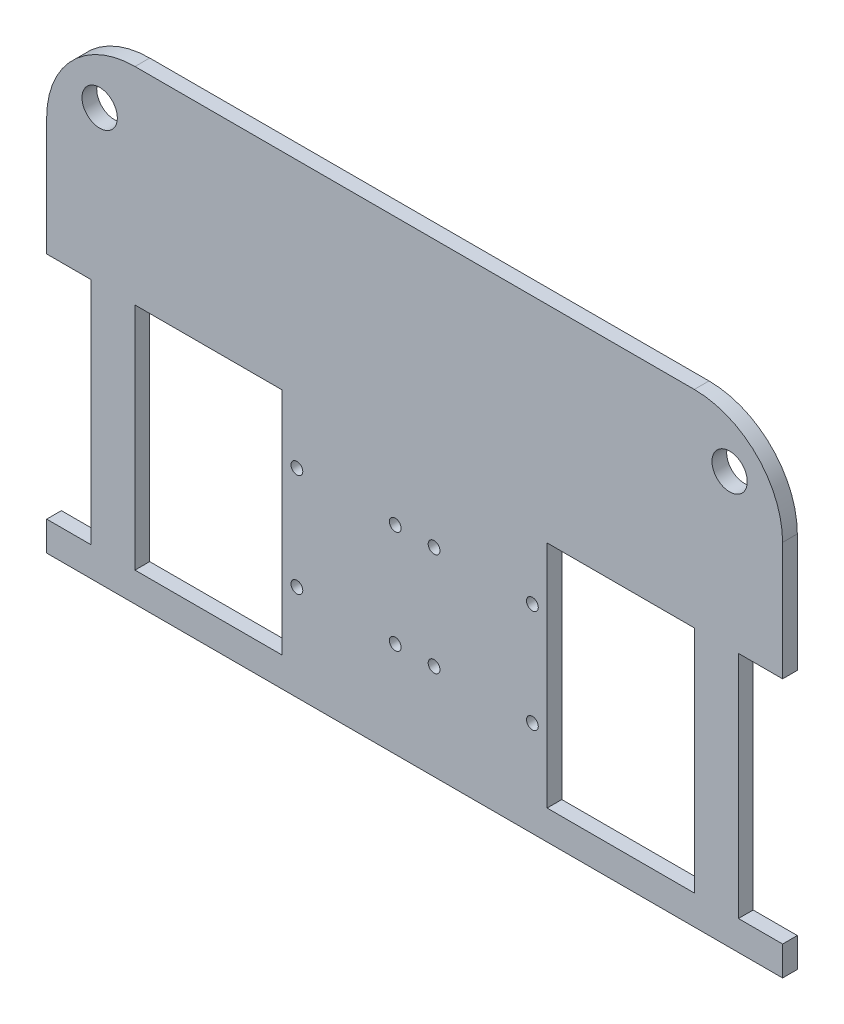
ISO-10303-21;
HEADER;
FILE_DESCRIPTION(('STEP AP214'),'2;1');
FILE_NAME('part.step','',(''),(''),'','','');
FILE_SCHEMA(('AUTOMOTIVE_DESIGN { 1 0 10303 214 1 1 1 1 }'));
ENDSEC;
DATA;
#1=APPLICATION_CONTEXT('core data for automotive mechanical design processes');
#2=APPLICATION_PROTOCOL_DEFINITION('international standard','automotive_design',2000,#1);
#3=PRODUCT_CONTEXT('',#1,'mechanical');
#4=PRODUCT('Part','Part','',(#3));
#5=PRODUCT_RELATED_PRODUCT_CATEGORY('part','',(#4));
#6=PRODUCT_DEFINITION_FORMATION('','',#4);
#7=PRODUCT_DEFINITION_CONTEXT('part definition',#1,'design');
#8=PRODUCT_DEFINITION('design','',#6,#7);
#9=PRODUCT_DEFINITION_SHAPE('','',#8);
#10=(LENGTH_UNIT() NAMED_UNIT(*) SI_UNIT(.MILLI.,.METRE.));
#11=(NAMED_UNIT(*) PLANE_ANGLE_UNIT() SI_UNIT($,.RADIAN.));
#12=(NAMED_UNIT(*) SI_UNIT($,.STERADIAN.) SOLID_ANGLE_UNIT());
#13=UNCERTAINTY_MEASURE_WITH_UNIT(LENGTH_MEASURE(1.E-05),#10,'distance_accuracy_value','');
#14=(GEOMETRIC_REPRESENTATION_CONTEXT(3) GLOBAL_UNCERTAINTY_ASSIGNED_CONTEXT((#13)) GLOBAL_UNIT_ASSIGNED_CONTEXT((#10,
#11,#12)) REPRESENTATION_CONTEXT('',''));
#15=CARTESIAN_POINT('',(0.,0.,0.));
#16=DIRECTION('',(0.,0.,1.));
#17=DIRECTION('',(1.,0.,0.));
#18=AXIS2_PLACEMENT_3D('',#15,#16,#17);
#19=CARTESIAN_POINT('',(0.,-74.4141853683438,-5.));
#20=DIRECTION('',(0.,-1.,0.));
#21=DIRECTION('',(0.,0.,-1.));
#22=AXIS2_PLACEMENT_3D('',#19,#20,#21);
#23=PLANE('',#22);
#24=DIRECTION('',(-1.,0.,0.));
#25=VECTOR('',#24,1.);
#26=CARTESIAN_POINT('',(114.232692949857,-74.4141853683438,0.));
#27=LINE('',#26,#25);
#28=CARTESIAN_POINT('',(-25.7673070501428,-74.4141853683438,0.));
#29=VERTEX_POINT('',#28);
#30=CARTESIAN_POINT('',(-75.7673070501427,-74.4141853683438,0.));
#31=VERTEX_POINT('',#30);
#32=EDGE_CURVE('E11',#29,#31,#27,.T.);
#33=ORIENTED_EDGE('',*,*,#32,.T.);
#34=DIRECTION('',(0.,0.,-1.));
#35=VECTOR('',#34,1.);
#36=CARTESIAN_POINT('',(-75.7673070501427,-74.4141853683437,5.));
#37=LINE('',#36,#35);
#38=CARTESIAN_POINT('',(-75.7673070501427,-74.4141853683438,5.));
#39=VERTEX_POINT('',#38);
#40=EDGE_CURVE('E49',#39,#31,#37,.T.);
#41=ORIENTED_EDGE('',*,*,#40,.F.);
#42=DIRECTION('',(1.,0.,0.));
#43=VECTOR('',#42,1.);
#44=CARTESIAN_POINT('',(0.,-74.4141853683438,5.));
#45=LINE('',#44,#43);
#46=CARTESIAN_POINT('',(-25.7673070501428,-74.4141853683438,5.));
#47=VERTEX_POINT('',#46);
#48=EDGE_CURVE('E252',#39,#47,#45,.T.);
#49=ORIENTED_EDGE('',*,*,#48,.T.);
#50=DIRECTION('',(0.,0.,1.));
#51=VECTOR('',#50,1.);
#52=CARTESIAN_POINT('',(-25.7673070501428,-74.4141853683438,-5.));
#53=LINE('',#52,#51);
#54=EDGE_CURVE('E258',#29,#47,#53,.T.);
#55=ORIENTED_EDGE('',*,*,#54,.F.);
#56=EDGE_LOOP('',(#33,#41,#49,#55));
#57=FACE_BOUND('',#56,.T.);
#58=ADVANCED_FACE('F35',(#57),#23,.F.);
#59=CARTESIAN_POINT('',(0.,3.58581463165624,-5.));
#60=DIRECTION('',(0.,1.,0.));
#61=DIRECTION('',(-1.,0.,0.));
#62=AXIS2_PLACEMENT_3D('',#59,#60,#61);
#63=PLANE('',#62);
#64=DIRECTION('',(-1.,0.,0.));
#65=VECTOR('',#64,1.);
#66=CARTESIAN_POINT('',(0.,3.58581463165624,5.));
#67=LINE('',#66,#65);
#68=CARTESIAN_POINT('',(-25.7673070501428,3.58581463165623,5.));
#69=VERTEX_POINT('',#68);
#70=CARTESIAN_POINT('',(-75.7673070501427,3.58581463165623,5.));
#71=VERTEX_POINT('',#70);
#72=EDGE_CURVE('E256',#69,#71,#67,.T.);
#73=ORIENTED_EDGE('',*,*,#72,.T.);
#74=DIRECTION('',(0.,0.,-1.));
#75=VECTOR('',#74,1.);
#76=CARTESIAN_POINT('',(-75.7673070501427,3.58581463165627,5.));
#77=LINE('',#76,#75);
#78=CARTESIAN_POINT('',(-75.7673070501427,3.58581463165627,0.));
#79=VERTEX_POINT('',#78);
#80=EDGE_CURVE('E212',#71,#79,#77,.T.);
#81=ORIENTED_EDGE('',*,*,#80,.T.);
#82=DIRECTION('',(1.,0.,0.));
#83=VECTOR('',#82,1.);
#84=CARTESIAN_POINT('',(114.232692949857,3.58581463165624,0.));
#85=LINE('',#84,#83);
#86=CARTESIAN_POINT('',(-25.7673070501428,3.58581463165623,0.));
#87=VERTEX_POINT('',#86);
#88=EDGE_CURVE('E400',#79,#87,#85,.T.);
#89=ORIENTED_EDGE('',*,*,#88,.T.);
#90=DIRECTION('',(0.,0.,1.));
#91=VECTOR('',#90,1.);
#92=CARTESIAN_POINT('',(-25.7673070501428,3.58581463165623,-5.));
#93=LINE('',#92,#91);
#94=EDGE_CURVE('E265',#87,#69,#93,.T.);
#95=ORIENTED_EDGE('',*,*,#94,.T.);
#96=EDGE_LOOP('',(#73,#81,#89,#95));
#97=FACE_BOUND('',#96,.T.);
#98=ADVANCED_FACE('F404',(#97),#63,.F.);
#99=CARTESIAN_POINT('',(0.,-74.4141853683438,-5.));
#100=DIRECTION('',(0.,1.,0.));
#101=DIRECTION('',(-1.,0.,0.));
#102=AXIS2_PLACEMENT_3D('',#99,#100,#101);
#103=PLANE('',#102);
#104=DIRECTION('',(0.,0.,-1.));
#105=VECTOR('',#104,1.);
#106=CARTESIAN_POINT('',(114.232692949857,-74.4141853683438,5.));
#107=LINE('',#106,#105);
#108=CARTESIAN_POINT('',(114.232692949857,-74.4141853683438,5.));
#109=VERTEX_POINT('',#108);
#110=CARTESIAN_POINT('',(114.232692949857,-74.4141853683438,0.));
#111=VERTEX_POINT('',#110);
#112=EDGE_CURVE('E230',#109,#111,#107,.T.);
#113=ORIENTED_EDGE('',*,*,#112,.T.);
#114=DIRECTION('',(1.,0.,0.));
#115=VECTOR('',#114,1.);
#116=CARTESIAN_POINT('',(114.232692949857,-74.4141853683438,0.));
#117=LINE('',#116,#115);
#118=CARTESIAN_POINT('',(64.2326929498572,-74.4141853683438,0.));
#119=VERTEX_POINT('',#118);
#120=EDGE_CURVE('E386',#119,#111,#117,.T.);
#121=ORIENTED_EDGE('',*,*,#120,.F.);
#122=DIRECTION('',(0.,0.,1.));
#123=VECTOR('',#122,1.);
#124=CARTESIAN_POINT('',(64.2326929498572,-74.4141853683438,-5.));
#125=LINE('',#124,#123);
#126=CARTESIAN_POINT('',(64.2326929498572,-74.4141853683438,5.));
#127=VERTEX_POINT('',#126);
#128=EDGE_CURVE('E275',#119,#127,#125,.T.);
#129=ORIENTED_EDGE('',*,*,#128,.T.);
#130=DIRECTION('',(-1.,0.,0.));
#131=VECTOR('',#130,1.);
#132=CARTESIAN_POINT('',(0.,-74.4141853683438,5.));
#133=LINE('',#132,#131);
#134=EDGE_CURVE('E311',#109,#127,#133,.T.);
#135=ORIENTED_EDGE('',*,*,#134,.F.);
#136=EDGE_LOOP('',(#113,#121,#129,#135));
#137=FACE_BOUND('',#136,.T.);
#138=ADVANCED_FACE('F440',(#137),#103,.T.);
#139=CARTESIAN_POINT('',(0.,3.58581463165623,-5.));
#140=DIRECTION('',(0.,-1.,0.));
#141=DIRECTION('',(1.,0.,0.));
#142=AXIS2_PLACEMENT_3D('',#139,#140,#141);
#143=PLANE('',#142);
#144=DIRECTION('',(0.,0.,-1.));
#145=VECTOR('',#144,1.);
#146=CARTESIAN_POINT('',(114.232692949857,3.58581463165625,5.));
#147=LINE('',#146,#145);
#148=CARTESIAN_POINT('',(114.232692949857,3.58581463165625,5.));
#149=VERTEX_POINT('',#148);
#150=CARTESIAN_POINT('',(114.232692949857,3.58581463165625,0.));
#151=VERTEX_POINT('',#150);
#152=EDGE_CURVE('E226',#149,#151,#147,.T.);
#153=ORIENTED_EDGE('',*,*,#152,.F.);
#154=DIRECTION('',(1.,0.,0.));
#155=VECTOR('',#154,1.);
#156=CARTESIAN_POINT('',(0.,3.58581463165623,5.));
#157=LINE('',#156,#155);
#158=CARTESIAN_POINT('',(64.2326929498572,3.58581463165624,5.));
#159=VERTEX_POINT('',#158);
#160=EDGE_CURVE('E308',#159,#149,#157,.T.);
#161=ORIENTED_EDGE('',*,*,#160,.F.);
#162=DIRECTION('',(0.,0.,1.));
#163=VECTOR('',#162,1.);
#164=CARTESIAN_POINT('',(64.2326929498572,3.58581463165624,-5.));
#165=LINE('',#164,#163);
#166=CARTESIAN_POINT('',(64.2326929498572,3.58581463165625,0.));
#167=VERTEX_POINT('',#166);
#168=EDGE_CURVE('E301',#167,#159,#165,.T.);
#169=ORIENTED_EDGE('',*,*,#168,.F.);
#170=DIRECTION('',(-1.,0.,0.));
#171=VECTOR('',#170,1.);
#172=CARTESIAN_POINT('',(114.232692949857,3.58581463165625,0.));
#173=LINE('',#172,#171);
#174=EDGE_CURVE('E366',#151,#167,#173,.T.);
#175=ORIENTED_EDGE('',*,*,#174,.F.);
#176=EDGE_LOOP('',(#153,#161,#169,#175));
#177=FACE_BOUND('',#176,.T.);
#178=ADVANCED_FACE('F492',(#177),#143,.T.);
#179=CARTESIAN_POINT('',(144.232692949857,43.740382531656,5.));
#180=DIRECTION('',(-1.,0.,0.));
#181=DIRECTION('',(0.,-1.,0.));
#182=AXIS2_PLACEMENT_3D('',#179,#180,#181);
#183=PLANE('',#182);
#184=DIRECTION('',(0.,0.,1.));
#185=VECTOR('',#184,1.);
#186=CARTESIAN_POINT('',(144.232692949857,-74.4141853683438,-5.));
#187=LINE('',#186,#185);
#188=CARTESIAN_POINT('',(144.232692949857,-74.4141853683438,0.));
#189=VERTEX_POINT('',#188);
#190=CARTESIAN_POINT('',(144.232692949857,-74.4141853683438,5.));
#191=VERTEX_POINT('',#190);
#192=EDGE_CURVE('E294',#189,#191,#187,.T.);
#193=ORIENTED_EDGE('',*,*,#192,.T.);
#194=DIRECTION('',(0.,1.,0.));
#195=VECTOR('',#194,1.);
#196=CARTESIAN_POINT('',(144.232692949857,43.740382531656,5.));
#197=LINE('',#196,#195);
#198=CARTESIAN_POINT('',(144.232692949857,-84.4141853676414,5.));
#199=VERTEX_POINT('',#198);
#200=EDGE_CURVE('E319',#199,#191,#197,.T.);
#201=ORIENTED_EDGE('',*,*,#200,.F.);
#202=DIRECTION('',(0.,0.,-1.));
#203=VECTOR('',#202,1.);
#204=CARTESIAN_POINT('',(144.232692949857,-84.4141853676414,5.));
#205=LINE('',#204,#203);
#206=CARTESIAN_POINT('',(144.232692949857,-84.4141853676414,0.));
#207=VERTEX_POINT('',#206);
#208=EDGE_CURVE('E363',#199,#207,#205,.T.);
#209=ORIENTED_EDGE('',*,*,#208,.T.);
#210=DIRECTION('',(0.,1.,0.));
#211=VECTOR('',#210,1.);
#212=CARTESIAN_POINT('',(144.232692949857,43.740382531656,0.));
#213=LINE('',#212,#211);
#214=EDGE_CURVE('E338',#207,#189,#213,.T.);
#215=ORIENTED_EDGE('',*,*,#214,.T.);
#216=EDGE_LOOP('',(#193,#201,#209,#215));
#217=FACE_BOUND('',#216,.T.);
#218=ADVANCED_FACE('F569',(#217),#183,.F.);
#219=DIRECTION('',(0.,0.,1.));
#220=VECTOR('',#219,1.);
#221=CARTESIAN_POINT('',(144.232692949857,3.58581463165625,-5.));
#222=LINE('',#221,#220);
#223=CARTESIAN_POINT('',(144.232692949857,3.58581463165625,0.));
#224=VERTEX_POINT('',#223);
#225=CARTESIAN_POINT('',(144.232692949857,3.58581463165625,5.));
#226=VERTEX_POINT('',#225);
#227=EDGE_CURVE('E298',#224,#226,#222,.T.);
#228=ORIENTED_EDGE('',*,*,#227,.F.);
#229=CARTESIAN_POINT('',(144.232692949857,43.740382531656,0.));
#230=VERTEX_POINT('',#229);
#231=EDGE_CURVE('E336',#224,#230,#213,.T.);
#232=ORIENTED_EDGE('',*,*,#231,.T.);
#233=DIRECTION('',(0.,0.,-1.));
#234=VECTOR('',#233,1.);
#235=CARTESIAN_POINT('',(144.232692949857,43.740382531656,5.));
#236=LINE('',#235,#234);
#237=CARTESIAN_POINT('',(144.232692949857,43.740382531656,5.));
#238=VERTEX_POINT('',#237);
#239=EDGE_CURVE('E360',#238,#230,#236,.T.);
#240=ORIENTED_EDGE('',*,*,#239,.F.);
#241=EDGE_CURVE('E317',#226,#238,#197,.T.);
#242=ORIENTED_EDGE('',*,*,#241,.F.);
#243=EDGE_LOOP('',(#228,#232,#240,#242));
#244=FACE_BOUND('',#243,.T.);
#245=ADVANCED_FACE('F429',(#244),#183,.F.);
#246=CARTESIAN_POINT('',(-105.767307050143,43.740382531656,5.));
#247=DIRECTION('',(1.,0.,0.));
#248=DIRECTION('',(0.,1.,0.));
#249=AXIS2_PLACEMENT_3D('',#246,#247,#248);
#250=PLANE('',#249);
#251=DIRECTION('',(0.,-1.,0.));
#252=VECTOR('',#251,1.);
#253=CARTESIAN_POINT('',(-105.767307050143,43.740382531656,5.));
#254=LINE('',#253,#252);
#255=CARTESIAN_POINT('',(-105.767307050143,-74.4141853683438,5.));
#256=VERTEX_POINT('',#255);
#257=CARTESIAN_POINT('',(-105.767307050143,-84.4141853676414,5.));
#258=VERTEX_POINT('',#257);
#259=EDGE_CURVE('E328',#256,#258,#254,.T.);
#260=ORIENTED_EDGE('',*,*,#259,.F.);
#261=DIRECTION('',(0.,0.,1.));
#262=VECTOR('',#261,1.);
#263=CARTESIAN_POINT('',(-105.767307050143,-74.4141853683438,-5.));
#264=LINE('',#263,#262);
#265=CARTESIAN_POINT('',(-105.767307050143,-74.4141853683438,0.));
#266=VERTEX_POINT('',#265);
#267=EDGE_CURVE('E259',#266,#256,#264,.T.);
#268=ORIENTED_EDGE('',*,*,#267,.F.);
#269=DIRECTION('',(0.,-1.,0.));
#270=VECTOR('',#269,1.);
#271=CARTESIAN_POINT('',(-105.767307050143,43.740382531656,0.));
#272=LINE('',#271,#270);
#273=CARTESIAN_POINT('',(-105.767307050143,-84.4141853676414,0.));
#274=VERTEX_POINT('',#273);
#275=EDGE_CURVE('E190',#266,#274,#272,.T.);
#276=ORIENTED_EDGE('',*,*,#275,.T.);
#277=DIRECTION('',(0.,0.,-1.));
#278=VECTOR('',#277,1.);
#279=CARTESIAN_POINT('',(-105.767307050143,-84.4141853676414,5.));
#280=LINE('',#279,#278);
#281=EDGE_CURVE('E332',#258,#274,#280,.T.);
#282=ORIENTED_EDGE('',*,*,#281,.F.);
#283=EDGE_LOOP('',(#260,#268,#276,#282));
#284=FACE_BOUND('',#283,.T.);
#285=ADVANCED_FACE('F421',(#284),#250,.F.);
#286=CARTESIAN_POINT('',(114.232692949857,43.7403825316562,5.));
#287=DIRECTION('',(0.,0.,-1.));
#288=DIRECTION('',(-1.,0.,0.));
#289=AXIS2_PLACEMENT_3D('',#286,#287,#288);
#290=PLANE('',#289);
#291=DIRECTION('',(0.,1.,0.));
#292=VECTOR('',#291,1.);
#293=CARTESIAN_POINT('',(-90.7673070501427,3.58581463165627,5.));
#294=LINE('',#293,#292);
#295=CARTESIAN_POINT('',(-90.7673070501427,-74.4141853683438,5.));
#296=VERTEX_POINT('',#295);
#297=CARTESIAN_POINT('',(-90.7673070501427,3.58581463165623,5.));
#298=VERTEX_POINT('',#297);
#299=EDGE_CURVE('E206',#296,#298,#294,.T.);
#300=ORIENTED_EDGE('',*,*,#299,.F.);
#301=EDGE_CURVE('E57',#256,#296,#45,.T.);
#302=ORIENTED_EDGE('',*,*,#301,.F.);
#303=ORIENTED_EDGE('',*,*,#259,.T.);
#304=DIRECTION('',(1.,0.,0.));
#305=VECTOR('',#304,1.);
#306=CARTESIAN_POINT('',(-105.767307050143,-84.4141853676414,5.));
#307=LINE('',#306,#305);
#308=EDGE_CURVE('E314',#258,#199,#307,.T.);
#309=ORIENTED_EDGE('',*,*,#308,.T.);
#310=ORIENTED_EDGE('',*,*,#200,.T.);
#311=CARTESIAN_POINT('',(129.232692949857,-74.4141853683438,5.));
#312=VERTEX_POINT('',#311);
#313=EDGE_CURVE('E293',#191,#312,#133,.T.);
#314=ORIENTED_EDGE('',*,*,#313,.T.);
#315=DIRECTION('',(0.,-1.,0.));
#316=VECTOR('',#315,1.);
#317=CARTESIAN_POINT('',(129.232692949857,3.58581463165625,5.));
#318=LINE('',#317,#316);
#319=CARTESIAN_POINT('',(129.232692949857,3.58581463165625,5.));
#320=VERTEX_POINT('',#319);
#321=EDGE_CURVE('E218',#320,#312,#318,.T.);
#322=ORIENTED_EDGE('',*,*,#321,.F.);
#323=EDGE_CURVE('E307',#320,#226,#157,.T.);
#324=ORIENTED_EDGE('',*,*,#323,.T.);
#325=ORIENTED_EDGE('',*,*,#241,.T.);
#326=CARTESIAN_POINT('',(114.232692949857,43.7403825316562,5.));
#327=DIRECTION('',(0.,0.,1.));
#328=DIRECTION('',(-1.,0.,0.));
#329=AXIS2_PLACEMENT_3D('',#326,#327,#328);
#330=CIRCLE('',#329,30.);
#331=CARTESIAN_POINT('',(114.232692949857,73.7403825316562,5.));
#332=VERTEX_POINT('',#331);
#333=EDGE_CURVE('E322',#238,#332,#330,.T.);
#334=ORIENTED_EDGE('',*,*,#333,.T.);
#335=DIRECTION('',(-1.,0.,0.));
#336=VECTOR('',#335,1.);
#337=CARTESIAN_POINT('',(-75.7673070501426,73.7403825316562,5.));
#338=LINE('',#337,#336);
#339=CARTESIAN_POINT('',(-75.7673070501426,73.7403825316562,5.));
#340=VERTEX_POINT('',#339);
#341=EDGE_CURVE('E324',#332,#340,#338,.T.);
#342=ORIENTED_EDGE('',*,*,#341,.T.);
#343=CARTESIAN_POINT('',(-75.7673070501428,43.7403825316562,5.));
#344=DIRECTION('',(0.,0.,1.));
#345=DIRECTION('',(-1.,0.,0.));
#346=AXIS2_PLACEMENT_3D('',#343,#344,#345);
#347=CIRCLE('',#346,30.);
#348=CARTESIAN_POINT('',(-105.767307050143,43.740382531656,5.));
#349=VERTEX_POINT('',#348);
#350=EDGE_CURVE('E326',#340,#349,#347,.T.);
#351=ORIENTED_EDGE('',*,*,#350,.T.);
#352=CARTESIAN_POINT('',(-105.767307050143,3.58581463165623,5.));
#353=VERTEX_POINT('',#352);
#354=EDGE_CURVE('E329',#349,#353,#254,.T.);
#355=ORIENTED_EDGE('',*,*,#354,.T.);
#356=EDGE_CURVE('E255',#298,#353,#67,.T.);
#357=ORIENTED_EDGE('',*,*,#356,.F.);
#358=EDGE_LOOP('',(#300,#302,#303,#309,#310,#314,#322,#324,#325,#334,#342,#351,#355,#357));
#359=FACE_BOUND('',#358,.T.);
#360=DIRECTION('',(0.,1.,0.));
#361=VECTOR('',#360,1.);
#362=CARTESIAN_POINT('',(114.232692949857,-74.4141853683438,5.));
#363=LINE('',#362,#361);
#364=EDGE_CURVE('E220',#109,#149,#363,.T.);
#365=ORIENTED_EDGE('',*,*,#364,.F.);
#366=ORIENTED_EDGE('',*,*,#134,.T.);
#367=DIRECTION('',(0.,1.,0.));
#368=VECTOR('',#367,1.);
#369=CARTESIAN_POINT('',(64.2326929498572,0.,5.));
#370=LINE('',#369,#368);
#371=EDGE_CURVE('E297',#127,#159,#370,.T.);
#372=ORIENTED_EDGE('',*,*,#371,.T.);
#373=ORIENTED_EDGE('',*,*,#160,.T.);
#374=EDGE_LOOP('',(#365,#366,#372,#373));
#375=FACE_BOUND('',#374,.T.);
#376=CARTESIAN_POINT('',(-87.7673070501429,55.6032752497306,5.));
#377=DIRECTION('',(0.,0.,-1.));
#378=DIRECTION('',(-1.,0.,0.));
#379=AXIS2_PLACEMENT_3D('',#376,#377,#378);
#380=CIRCLE('',#379,6.);
#381=CARTESIAN_POINT('',(-93.7673070501429,55.6032752497306,5.));
#382=VERTEX_POINT('',#381);
#383=EDGE_CURVE('E241',#382,#382,#380,.F.);
#384=ORIENTED_EDGE('',*,*,#383,.F.);
#385=EDGE_LOOP('',(#384));
#386=FACE_BOUND('',#385,.T.);
#387=CARTESIAN_POINT('',(126.232692949857,55.6032752497306,5.));
#388=DIRECTION('',(0.,0.,-1.));
#389=DIRECTION('',(-1.,0.,0.));
#390=AXIS2_PLACEMENT_3D('',#387,#388,#389);
#391=CIRCLE('',#390,5.99999999999999);
#392=CARTESIAN_POINT('',(120.232692949857,55.6032752497306,5.));
#393=VERTEX_POINT('',#392);
#394=EDGE_CURVE('E242',#393,#393,#391,.F.);
#395=ORIENTED_EDGE('',*,*,#394,.F.);
#396=EDGE_LOOP('',(#395));
#397=FACE_BOUND('',#396,.T.);
#398=CARTESIAN_POINT('',(-20.7673070501428,-16.9141853676413,5.));
#399=DIRECTION('',(0.,0.,1.));
#400=DIRECTION('',(1.,0.,0.));
#401=AXIS2_PLACEMENT_3D('',#398,#399,#400);
#402=CIRCLE('',#401,2.);
#403=CARTESIAN_POINT('',(-18.7673070501428,-16.9141853676413,5.));
#404=VERTEX_POINT('',#403);
#405=EDGE_CURVE('E284',#404,#404,#402,.T.);
#406=ORIENTED_EDGE('',*,*,#405,.F.);
#407=EDGE_LOOP('',(#406));
#408=FACE_BOUND('',#407,.T.);
#409=CARTESIAN_POINT('',(12.6326929498572,-51.9141853676414,5.));
#410=DIRECTION('',(0.,0.,1.));
#411=DIRECTION('',(1.,0.,0.));
#412=AXIS2_PLACEMENT_3D('',#409,#410,#411);
#413=CIRCLE('',#412,1.99999999999999);
#414=CARTESIAN_POINT('',(14.6326929498572,-51.9141853676414,5.));
#415=VERTEX_POINT('',#414);
#416=EDGE_CURVE('E290',#415,#415,#413,.T.);
#417=ORIENTED_EDGE('',*,*,#416,.F.);
#418=EDGE_LOOP('',(#417));
#419=FACE_BOUND('',#418,.T.);
#420=CARTESIAN_POINT('',(25.8326929498572,-16.9141853676413,5.));
#421=DIRECTION('',(0.,0.,1.));
#422=DIRECTION('',(1.,0.,0.));
#423=AXIS2_PLACEMENT_3D('',#420,#421,#422);
#424=CIRCLE('',#423,2.);
#425=CARTESIAN_POINT('',(27.8326929498572,-16.9141853676413,5.));
#426=VERTEX_POINT('',#425);
#427=EDGE_CURVE('E272',#426,#426,#424,.F.);
#428=ORIENTED_EDGE('',*,*,#427,.T.);
#429=EDGE_LOOP('',(#428));
#430=FACE_BOUND('',#429,.T.);
#431=CARTESIAN_POINT('',(59.2326929498572,-16.9141853676413,5.));
#432=DIRECTION('',(0.,0.,1.));
#433=DIRECTION('',(1.,0.,0.));
#434=AXIS2_PLACEMENT_3D('',#431,#432,#433);
#435=CIRCLE('',#434,2.);
#436=CARTESIAN_POINT('',(61.2326929498572,-16.9141853676413,5.));
#437=VERTEX_POINT('',#436);
#438=EDGE_CURVE('E276',#437,#437,#435,.F.);
#439=ORIENTED_EDGE('',*,*,#438,.T.);
#440=EDGE_LOOP('',(#439));
#441=FACE_BOUND('',#440,.T.);
#442=CARTESIAN_POINT('',(25.8326929498572,-51.9141853676414,5.));
#443=DIRECTION('',(0.,0.,1.));
#444=DIRECTION('',(1.,0.,0.));
#445=AXIS2_PLACEMENT_3D('',#442,#443,#444);
#446=CIRCLE('',#445,1.99999999999999);
#447=CARTESIAN_POINT('',(27.8326929498572,-51.9141853676414,5.));
#448=VERTEX_POINT('',#447);
#449=EDGE_CURVE('E279',#448,#448,#446,.F.);
#450=ORIENTED_EDGE('',*,*,#449,.T.);
#451=EDGE_LOOP('',(#450));
#452=FACE_BOUND('',#451,.T.);
#453=CARTESIAN_POINT('',(59.2326929498572,-51.9141853676413,5.));
#454=DIRECTION('',(0.,0.,1.));
#455=DIRECTION('',(1.,0.,0.));
#456=AXIS2_PLACEMENT_3D('',#453,#454,#455);
#457=CIRCLE('',#456,2.);
#458=CARTESIAN_POINT('',(61.2326929498572,-51.9141853676413,5.));
#459=VERTEX_POINT('',#458);
#460=EDGE_CURVE('E271',#459,#459,#457,.F.);
#461=ORIENTED_EDGE('',*,*,#460,.T.);
#462=EDGE_LOOP('',(#461));
#463=FACE_BOUND('',#462,.T.);
#464=CARTESIAN_POINT('',(-20.7673070501428,-51.9141853676414,5.));
#465=DIRECTION('',(0.,0.,1.));
#466=DIRECTION('',(1.,0.,0.));
#467=AXIS2_PLACEMENT_3D('',#464,#465,#466);
#468=CIRCLE('',#467,2.);
#469=CARTESIAN_POINT('',(-18.7673070501428,-51.9141853676414,5.));
#470=VERTEX_POINT('',#469);
#471=EDGE_CURVE('E287',#470,#470,#468,.T.);
#472=ORIENTED_EDGE('',*,*,#471,.F.);
#473=EDGE_LOOP('',(#472));
#474=FACE_BOUND('',#473,.T.);
#475=CARTESIAN_POINT('',(12.6326929498572,-16.9141853676413,5.));
#476=DIRECTION('',(0.,0.,1.));
#477=DIRECTION('',(1.,0.,0.));
#478=AXIS2_PLACEMENT_3D('',#475,#476,#477);
#479=CIRCLE('',#478,2.);
#480=CARTESIAN_POINT('',(14.6326929498572,-16.9141853676413,5.));
#481=VERTEX_POINT('',#480);
#482=EDGE_CURVE('E245',#481,#481,#479,.T.);
#483=ORIENTED_EDGE('',*,*,#482,.F.);
#484=EDGE_LOOP('',(#483));
#485=FACE_BOUND('',#484,.T.);
#486=DIRECTION('',(0.,1.,0.));
#487=VECTOR('',#486,1.);
#488=CARTESIAN_POINT('',(-25.7673070501428,0.,5.));
#489=LINE('',#488,#487);
#490=EDGE_CURVE('E251',#47,#69,#489,.T.);
#491=ORIENTED_EDGE('',*,*,#490,.F.);
#492=ORIENTED_EDGE('',*,*,#48,.F.);
#493=DIRECTION('',(0.,-1.,0.));
#494=VECTOR('',#493,1.);
#495=CARTESIAN_POINT('',(-75.7673070501427,-74.4141853683437,5.));
#496=LINE('',#495,#494);
#497=EDGE_CURVE('E202',#71,#39,#496,.T.);
#498=ORIENTED_EDGE('',*,*,#497,.F.);
#499=ORIENTED_EDGE('',*,*,#72,.F.);
#500=EDGE_LOOP('',(#491,#492,#498,#499));
#501=FACE_BOUND('',#500,.T.);
#502=ADVANCED_FACE('F419',(#359,#375,#386,#397,#408,#419,#430,#441,#452,#463,#474,#485,#501),
#290,.F.);
#503=CARTESIAN_POINT('',(114.232692949857,43.7403825316562,0.));
#504=DIRECTION('',(0.,0.,-1.));
#505=DIRECTION('',(-1.,0.,0.));
#506=AXIS2_PLACEMENT_3D('',#503,#504,#505);
#507=PLANE('',#506);
#508=CARTESIAN_POINT('',(-90.7673070501427,-74.4141853683437,0.));
#509=VERTEX_POINT('',#508);
#510=EDGE_CURVE('E43',#509,#266,#27,.T.);
#511=ORIENTED_EDGE('',*,*,#510,.F.);
#512=DIRECTION('',(0.,1.,0.));
#513=VECTOR('',#512,1.);
#514=CARTESIAN_POINT('',(-90.7673070501427,3.58581463165627,0.));
#515=LINE('',#514,#513);
#516=CARTESIAN_POINT('',(-90.7673070501427,3.58581463165622,0.));
#517=VERTEX_POINT('',#516);
#518=EDGE_CURVE('E188',#509,#517,#515,.T.);
#519=ORIENTED_EDGE('',*,*,#518,.T.);
#520=CARTESIAN_POINT('',(-105.767307050143,3.58581463165623,0.));
#521=VERTEX_POINT('',#520);
#522=EDGE_CURVE('E192',#521,#517,#85,.T.);
#523=ORIENTED_EDGE('',*,*,#522,.F.);
#524=CARTESIAN_POINT('',(-105.767307050143,43.740382531656,0.));
#525=VERTEX_POINT('',#524);
#526=EDGE_CURVE('E318',#525,#521,#272,.T.);
#527=ORIENTED_EDGE('',*,*,#526,.F.);
#528=CARTESIAN_POINT('',(-75.7673070501428,43.7403825316562,0.));
#529=DIRECTION('',(0.,0.,1.));
#530=DIRECTION('',(-1.,0.,0.));
#531=AXIS2_PLACEMENT_3D('',#528,#529,#530);
#532=CIRCLE('',#531,30.);
#533=CARTESIAN_POINT('',(-75.7673070501426,73.7403825316562,0.));
#534=VERTEX_POINT('',#533);
#535=EDGE_CURVE('E345',#534,#525,#532,.T.);
#536=ORIENTED_EDGE('',*,*,#535,.F.);
#537=DIRECTION('',(-1.,0.,0.));
#538=VECTOR('',#537,1.);
#539=CARTESIAN_POINT('',(-75.7673070501426,73.7403825316562,0.));
#540=LINE('',#539,#538);
#541=CARTESIAN_POINT('',(114.232692949857,73.7403825316562,0.));
#542=VERTEX_POINT('',#541);
#543=EDGE_CURVE('E343',#542,#534,#540,.T.);
#544=ORIENTED_EDGE('',*,*,#543,.F.);
#545=CARTESIAN_POINT('',(114.232692949857,43.7403825316562,0.));
#546=DIRECTION('',(0.,0.,1.));
#547=DIRECTION('',(-1.,0.,0.));
#548=AXIS2_PLACEMENT_3D('',#545,#546,#547);
#549=CIRCLE('',#548,30.);
#550=EDGE_CURVE('E341',#230,#542,#549,.T.);
#551=ORIENTED_EDGE('',*,*,#550,.F.);
#552=ORIENTED_EDGE('',*,*,#231,.F.);
#553=CARTESIAN_POINT('',(129.232692949857,3.58581463165625,0.));
#554=VERTEX_POINT('',#553);
#555=EDGE_CURVE('E379',#224,#554,#173,.T.);
#556=ORIENTED_EDGE('',*,*,#555,.T.);
#557=DIRECTION('',(0.,-1.,0.));
#558=VECTOR('',#557,1.);
#559=CARTESIAN_POINT('',(129.232692949857,3.58581463165625,0.));
#560=LINE('',#559,#558);
#561=CARTESIAN_POINT('',(129.232692949857,-74.4141853683438,0.));
#562=VERTEX_POINT('',#561);
#563=EDGE_CURVE('E215',#554,#562,#560,.T.);
#564=ORIENTED_EDGE('',*,*,#563,.T.);
#565=EDGE_CURVE('E385',#562,#189,#117,.T.);
#566=ORIENTED_EDGE('',*,*,#565,.T.);
#567=ORIENTED_EDGE('',*,*,#214,.F.);
#568=DIRECTION('',(1.,0.,0.));
#569=VECTOR('',#568,1.);
#570=CARTESIAN_POINT('',(-105.767307050143,-84.4141853676414,0.));
#571=LINE('',#570,#569);
#572=EDGE_CURVE('E333',#274,#207,#571,.T.);
#573=ORIENTED_EDGE('',*,*,#572,.F.);
#574=ORIENTED_EDGE('',*,*,#275,.F.);
#575=EDGE_LOOP('',(#511,#519,#523,#527,#536,#544,#551,#552,#556,#564,#566,#567,#573,#574));
#576=FACE_BOUND('',#575,.T.);
#577=ORIENTED_EDGE('',*,*,#120,.T.);
#578=DIRECTION('',(0.,1.,0.));
#579=VECTOR('',#578,1.);
#580=CARTESIAN_POINT('',(114.232692949857,-74.4141853683438,0.));
#581=LINE('',#580,#579);
#582=EDGE_CURVE('E221',#111,#151,#581,.T.);
#583=ORIENTED_EDGE('',*,*,#582,.T.);
#584=ORIENTED_EDGE('',*,*,#174,.T.);
#585=DIRECTION('',(0.,-1.,0.));
#586=VECTOR('',#585,1.);
#587=CARTESIAN_POINT('',(64.2326929498572,43.7403825316562,0.));
#588=LINE('',#587,#586);
#589=EDGE_CURVE('E382',#167,#119,#588,.T.);
#590=ORIENTED_EDGE('',*,*,#589,.T.);
#591=EDGE_LOOP('',(#577,#583,#584,#590));
#592=FACE_BOUND('',#591,.T.);
#593=CARTESIAN_POINT('',(-87.7673070501429,55.6032752497306,0.));
#594=DIRECTION('',(0.,0.,-1.));
#595=DIRECTION('',(-1.,0.,0.));
#596=AXIS2_PLACEMENT_3D('',#593,#594,#595);
#597=CIRCLE('',#596,6.);
#598=CARTESIAN_POINT('',(-93.7673070501429,55.6032752497306,0.));
#599=VERTEX_POINT('',#598);
#600=EDGE_CURVE('E238',#599,#599,#597,.T.);
#601=ORIENTED_EDGE('',*,*,#600,.F.);
#602=EDGE_LOOP('',(#601));
#603=FACE_BOUND('',#602,.T.);
#604=CARTESIAN_POINT('',(126.232692949857,55.6032752497306,0.));
#605=DIRECTION('',(0.,0.,-1.));
#606=DIRECTION('',(1.,0.,0.));
#607=AXIS2_PLACEMENT_3D('',#604,#605,#606);
#608=CIRCLE('',#607,5.99999999999999);
#609=CARTESIAN_POINT('',(132.232692949857,55.6032752497306,0.));
#610=VERTEX_POINT('',#609);
#611=EDGE_CURVE('E229',#610,#610,#608,.T.);
#612=ORIENTED_EDGE('',*,*,#611,.F.);
#613=EDGE_LOOP('',(#612));
#614=FACE_BOUND('',#613,.T.);
#615=CARTESIAN_POINT('',(12.6326929498572,-16.9141853676413,0.));
#616=DIRECTION('',(0.,0.,-1.));
#617=DIRECTION('',(-1.,0.,0.));
#618=AXIS2_PLACEMENT_3D('',#615,#616,#617);
#619=CIRCLE('',#618,2.);
#620=CARTESIAN_POINT('',(10.6326929498572,-16.9141853676413,0.));
#621=VERTEX_POINT('',#620);
#622=EDGE_CURVE('E337',#621,#621,#619,.T.);
#623=ORIENTED_EDGE('',*,*,#622,.F.);
#624=EDGE_LOOP('',(#623));
#625=FACE_BOUND('',#624,.T.);
#626=CARTESIAN_POINT('',(-20.7673070501428,-16.9141853676413,0.));
#627=DIRECTION('',(0.,0.,-1.));
#628=DIRECTION('',(-1.,0.,0.));
#629=AXIS2_PLACEMENT_3D('',#626,#627,#628);
#630=CIRCLE('',#629,2.);
#631=CARTESIAN_POINT('',(-22.7673070501428,-16.9141853676413,0.));
#632=VERTEX_POINT('',#631);
#633=EDGE_CURVE('E395',#632,#632,#630,.T.);
#634=ORIENTED_EDGE('',*,*,#633,.F.);
#635=EDGE_LOOP('',(#634));
#636=FACE_BOUND('',#635,.T.);
#637=CARTESIAN_POINT('',(-20.7673070501428,-51.9141853676414,0.));
#638=DIRECTION('',(0.,0.,-1.));
#639=DIRECTION('',(-1.,0.,0.));
#640=AXIS2_PLACEMENT_3D('',#637,#638,#639);
#641=CIRCLE('',#640,2.);
#642=CARTESIAN_POINT('',(-22.7673070501428,-51.9141853676414,0.));
#643=VERTEX_POINT('',#642);
#644=EDGE_CURVE('E392',#643,#643,#641,.T.);
#645=ORIENTED_EDGE('',*,*,#644,.F.);
#646=EDGE_LOOP('',(#645));
#647=FACE_BOUND('',#646,.T.);
#648=CARTESIAN_POINT('',(12.6326929498572,-51.9141853676414,0.));
#649=DIRECTION('',(0.,0.,-1.));
#650=DIRECTION('',(-1.,0.,0.));
#651=AXIS2_PLACEMENT_3D('',#648,#649,#650);
#652=CIRCLE('',#651,1.99999999999999);
#653=CARTESIAN_POINT('',(10.6326929498572,-51.9141853676414,0.));
#654=VERTEX_POINT('',#653);
#655=EDGE_CURVE('E378',#654,#654,#652,.T.);
#656=ORIENTED_EDGE('',*,*,#655,.F.);
#657=EDGE_LOOP('',(#656));
#658=FACE_BOUND('',#657,.T.);
#659=CARTESIAN_POINT('',(59.2326929498572,-51.9141853676413,0.));
#660=DIRECTION('',(0.,0.,-1.));
#661=DIRECTION('',(-1.,0.,0.));
#662=AXIS2_PLACEMENT_3D('',#659,#660,#661);
#663=CIRCLE('',#662,2.);
#664=CARTESIAN_POINT('',(57.2326929498572,-51.9141853676413,0.));
#665=VERTEX_POINT('',#664);
#666=EDGE_CURVE('E261',#665,#665,#663,.F.);
#667=ORIENTED_EDGE('',*,*,#666,.T.);
#668=EDGE_LOOP('',(#667));
#669=FACE_BOUND('',#668,.T.);
#670=CARTESIAN_POINT('',(25.8326929498572,-51.9141853676414,0.));
#671=DIRECTION('',(0.,0.,-1.));
#672=DIRECTION('',(-1.,0.,0.));
#673=AXIS2_PLACEMENT_3D('',#670,#671,#672);
#674=CIRCLE('',#673,1.99999999999999);
#675=CARTESIAN_POINT('',(23.8326929498572,-51.9141853676414,0.));
#676=VERTEX_POINT('',#675);
#677=EDGE_CURVE('E369',#676,#676,#674,.F.);
#678=ORIENTED_EDGE('',*,*,#677,.T.);
#679=EDGE_LOOP('',(#678));
#680=FACE_BOUND('',#679,.T.);
#681=CARTESIAN_POINT('',(59.2326929498572,-16.9141853676413,0.));
#682=DIRECTION('',(0.,0.,-1.));
#683=DIRECTION('',(-1.,0.,0.));
#684=AXIS2_PLACEMENT_3D('',#681,#682,#683);
#685=CIRCLE('',#684,2.);
#686=CARTESIAN_POINT('',(57.2326929498572,-16.9141853676413,0.));
#687=VERTEX_POINT('',#686);
#688=EDGE_CURVE('E372',#687,#687,#685,.F.);
#689=ORIENTED_EDGE('',*,*,#688,.T.);
#690=EDGE_LOOP('',(#689));
#691=FACE_BOUND('',#690,.T.);
#692=CARTESIAN_POINT('',(25.8326929498572,-16.9141853676413,0.));
#693=DIRECTION('',(0.,0.,-1.));
#694=DIRECTION('',(-1.,0.,0.));
#695=AXIS2_PLACEMENT_3D('',#692,#693,#694);
#696=CIRCLE('',#695,2.);
#697=CARTESIAN_POINT('',(23.8326929498572,-16.9141853676413,0.));
#698=VERTEX_POINT('',#697);
#699=EDGE_CURVE('E375',#698,#698,#696,.F.);
#700=ORIENTED_EDGE('',*,*,#699,.T.);
#701=EDGE_LOOP('',(#700));
#702=FACE_BOUND('',#701,.T.);
#703=ORIENTED_EDGE('',*,*,#32,.F.);
#704=DIRECTION('',(0.,-1.,0.));
#705=VECTOR('',#704,1.);
#706=CARTESIAN_POINT('',(-25.7673070501428,43.7403825316562,0.));
#707=LINE('',#706,#705);
#708=EDGE_CURVE('E389',#87,#29,#707,.T.);
#709=ORIENTED_EDGE('',*,*,#708,.F.);
#710=ORIENTED_EDGE('',*,*,#88,.F.);
#711=DIRECTION('',(0.,-1.,0.));
#712=VECTOR('',#711,1.);
#713=CARTESIAN_POINT('',(-75.7673070501427,-74.4141853683437,0.));
#714=LINE('',#713,#712);
#715=EDGE_CURVE('E203',#79,#31,#714,.T.);
#716=ORIENTED_EDGE('',*,*,#715,.T.);
#717=EDGE_LOOP('',(#703,#709,#710,#716));
#718=FACE_BOUND('',#717,.T.);
#719=ADVANCED_FACE('F184',(#576,#592,#603,#614,#625,#636,#647,#658,#669,#680,#691,#702,#718),
#507,.T.);
#720=CARTESIAN_POINT('',(-105.767307050143,-84.4141853676414,5.));
#721=DIRECTION('',(0.,1.,0.));
#722=DIRECTION('',(0.,0.,1.));
#723=AXIS2_PLACEMENT_3D('',#720,#721,#722);
#724=PLANE('',#723);
#725=ORIENTED_EDGE('',*,*,#572,.T.);
#726=ORIENTED_EDGE('',*,*,#208,.F.);
#727=ORIENTED_EDGE('',*,*,#308,.F.);
#728=ORIENTED_EDGE('',*,*,#281,.T.);
#729=EDGE_LOOP('',(#725,#726,#727,#728));
#730=FACE_BOUND('',#729,.T.);
#731=ADVANCED_FACE('F37',(#730),#724,.F.);
#732=CARTESIAN_POINT('',(114.232692949857,43.7403825316562,5.));
#733=DIRECTION('',(0.,0.,-1.));
#734=DIRECTION('',(-1.,0.,0.));
#735=AXIS2_PLACEMENT_3D('',#732,#733,#734);
#736=CYLINDRICAL_SURFACE('',#735,30.);
#737=ORIENTED_EDGE('',*,*,#550,.T.);
#738=DIRECTION('',(0.,0.,-1.));
#739=VECTOR('',#738,1.);
#740=CARTESIAN_POINT('',(114.232692949857,73.7403825316562,5.));
#741=LINE('',#740,#739);
#742=EDGE_CURVE('E357',#332,#542,#741,.T.);
#743=ORIENTED_EDGE('',*,*,#742,.F.);
#744=ORIENTED_EDGE('',*,*,#333,.F.);
#745=ORIENTED_EDGE('',*,*,#239,.T.);
#746=EDGE_LOOP('',(#737,#743,#744,#745));
#747=FACE_BOUND('',#746,.T.);
#748=ADVANCED_FACE('F729',(#747),#736,.T.);
#749=CARTESIAN_POINT('',(-75.7673070501426,73.7403825316562,5.));
#750=DIRECTION('',(0.,-1.,0.));
#751=DIRECTION('',(0.,0.,-1.));
#752=AXIS2_PLACEMENT_3D('',#749,#750,#751);
#753=PLANE('',#752);
#754=ORIENTED_EDGE('',*,*,#543,.T.);
#755=DIRECTION('',(0.,0.,-1.));
#756=VECTOR('',#755,1.);
#757=CARTESIAN_POINT('',(-75.7673070501426,73.7403825316562,5.));
#758=LINE('',#757,#756);
#759=EDGE_CURVE('E354',#340,#534,#758,.T.);
#760=ORIENTED_EDGE('',*,*,#759,.F.);
#761=ORIENTED_EDGE('',*,*,#341,.F.);
#762=ORIENTED_EDGE('',*,*,#742,.T.);
#763=EDGE_LOOP('',(#754,#760,#761,#762));
#764=FACE_BOUND('',#763,.T.);
#765=ADVANCED_FACE('F719',(#764),#753,.F.);
#766=CARTESIAN_POINT('',(-75.7673070501428,43.7403825316562,5.));
#767=DIRECTION('',(0.,0.,-1.));
#768=DIRECTION('',(-1.,0.,0.));
#769=AXIS2_PLACEMENT_3D('',#766,#767,#768);
#770=CYLINDRICAL_SURFACE('',#769,30.);
#771=ORIENTED_EDGE('',*,*,#535,.T.);
#772=DIRECTION('',(0.,0.,-1.));
#773=VECTOR('',#772,1.);
#774=CARTESIAN_POINT('',(-105.767307050143,43.740382531656,5.));
#775=LINE('',#774,#773);
#776=EDGE_CURVE('E351',#349,#525,#775,.T.);
#777=ORIENTED_EDGE('',*,*,#776,.F.);
#778=ORIENTED_EDGE('',*,*,#350,.F.);
#779=ORIENTED_EDGE('',*,*,#759,.T.);
#780=EDGE_LOOP('',(#771,#777,#778,#779));
#781=FACE_BOUND('',#780,.T.);
#782=ADVANCED_FACE('F688',(#781),#770,.T.);
#783=ORIENTED_EDGE('',*,*,#526,.T.);
#784=DIRECTION('',(0.,0.,1.));
#785=VECTOR('',#784,1.);
#786=CARTESIAN_POINT('',(-105.767307050143,3.58581463165623,-5.));
#787=LINE('',#786,#785);
#788=EDGE_CURVE('E262',#521,#353,#787,.T.);
#789=ORIENTED_EDGE('',*,*,#788,.T.);
#790=ORIENTED_EDGE('',*,*,#354,.F.);
#791=ORIENTED_EDGE('',*,*,#776,.T.);
#792=EDGE_LOOP('',(#783,#789,#790,#791));
#793=FACE_BOUND('',#792,.T.);
#794=ADVANCED_FACE('F432',(#793),#250,.F.);
#795=CARTESIAN_POINT('',(59.2326929498572,-51.9141853676413,-5.));
#796=DIRECTION('',(0.,0.,1.));
#797=DIRECTION('',(1.,0.,0.));
#798=AXIS2_PLACEMENT_3D('',#795,#796,#797);
#799=CYLINDRICAL_SURFACE('',#798,2.);
#800=ORIENTED_EDGE('',*,*,#666,.F.);
#801=EDGE_LOOP('',(#800));
#802=FACE_BOUND('',#801,.T.);
#803=ORIENTED_EDGE('',*,*,#460,.F.);
#804=EDGE_LOOP('',(#803));
#805=FACE_BOUND('',#804,.T.);
#806=ADVANCED_FACE('F473',(#802,#805),#799,.F.);
#807=CARTESIAN_POINT('',(25.8326929498572,-51.9141853676414,-5.));
#808=DIRECTION('',(0.,0.,1.));
#809=DIRECTION('',(1.,0.,0.));
#810=AXIS2_PLACEMENT_3D('',#807,#808,#809);
#811=CYLINDRICAL_SURFACE('',#810,1.99999999999999);
#812=ORIENTED_EDGE('',*,*,#677,.F.);
#813=EDGE_LOOP('',(#812));
#814=FACE_BOUND('',#813,.T.);
#815=ORIENTED_EDGE('',*,*,#449,.F.);
#816=EDGE_LOOP('',(#815));
#817=FACE_BOUND('',#816,.T.);
#818=ADVANCED_FACE('F469',(#814,#817),#811,.F.);
#819=CARTESIAN_POINT('',(59.2326929498572,-16.9141853676413,-5.));
#820=DIRECTION('',(0.,0.,1.));
#821=DIRECTION('',(1.,0.,0.));
#822=AXIS2_PLACEMENT_3D('',#819,#820,#821);
#823=CYLINDRICAL_SURFACE('',#822,2.);
#824=ORIENTED_EDGE('',*,*,#688,.F.);
#825=EDGE_LOOP('',(#824));
#826=FACE_BOUND('',#825,.T.);
#827=ORIENTED_EDGE('',*,*,#438,.F.);
#828=EDGE_LOOP('',(#827));
#829=FACE_BOUND('',#828,.T.);
#830=ADVANCED_FACE('F465',(#826,#829),#823,.F.);
#831=CARTESIAN_POINT('',(25.8326929498572,-16.9141853676413,-5.));
#832=DIRECTION('',(0.,0.,1.));
#833=DIRECTION('',(1.,0.,0.));
#834=AXIS2_PLACEMENT_3D('',#831,#832,#833);
#835=CYLINDRICAL_SURFACE('',#834,2.);
#836=ORIENTED_EDGE('',*,*,#699,.F.);
#837=EDGE_LOOP('',(#836));
#838=FACE_BOUND('',#837,.T.);
#839=ORIENTED_EDGE('',*,*,#427,.F.);
#840=EDGE_LOOP('',(#839));
#841=FACE_BOUND('',#840,.T.);
#842=ADVANCED_FACE('F461',(#838,#841),#835,.F.);
#843=DIRECTION('',(0.,0.,-1.));
#844=VECTOR('',#843,1.);
#845=CARTESIAN_POINT('',(129.232692949857,-74.4141853683438,5.));
#846=LINE('',#845,#844);
#847=EDGE_CURVE('E233',#312,#562,#846,.T.);
#848=ORIENTED_EDGE('',*,*,#847,.F.);
#849=ORIENTED_EDGE('',*,*,#313,.F.);
#850=ORIENTED_EDGE('',*,*,#192,.F.);
#851=ORIENTED_EDGE('',*,*,#565,.F.);
#852=EDGE_LOOP('',(#848,#849,#850,#851));
#853=FACE_BOUND('',#852,.T.);
#854=ADVANCED_FACE('F464',(#853),#103,.T.);
#855=CARTESIAN_POINT('',(64.2326929498572,0.,-5.));
#856=DIRECTION('',(1.,0.,0.));
#857=DIRECTION('',(0.,1.,0.));
#858=AXIS2_PLACEMENT_3D('',#855,#856,#857);
#859=PLANE('',#858);
#860=ORIENTED_EDGE('',*,*,#168,.T.);
#861=ORIENTED_EDGE('',*,*,#371,.F.);
#862=ORIENTED_EDGE('',*,*,#128,.F.);
#863=ORIENTED_EDGE('',*,*,#589,.F.);
#864=EDGE_LOOP('',(#860,#861,#862,#863));
#865=FACE_BOUND('',#864,.T.);
#866=ADVANCED_FACE('F488',(#865),#859,.T.);
#867=DIRECTION('',(0.,0.,-1.));
#868=VECTOR('',#867,1.);
#869=CARTESIAN_POINT('',(129.232692949857,3.58581463165625,5.));
#870=LINE('',#869,#868);
#871=EDGE_CURVE('E223',#320,#554,#870,.T.);
#872=ORIENTED_EDGE('',*,*,#871,.T.);
#873=ORIENTED_EDGE('',*,*,#555,.F.);
#874=ORIENTED_EDGE('',*,*,#227,.T.);
#875=ORIENTED_EDGE('',*,*,#323,.F.);
#876=EDGE_LOOP('',(#872,#873,#874,#875));
#877=FACE_BOUND('',#876,.T.);
#878=ADVANCED_FACE('F484',(#877),#143,.T.);
#879=CARTESIAN_POINT('',(12.6326929498572,-51.9141853676414,-5.));
#880=DIRECTION('',(0.,0.,1.));
#881=DIRECTION('',(1.,0.,0.));
#882=AXIS2_PLACEMENT_3D('',#879,#880,#881);
#883=CYLINDRICAL_SURFACE('',#882,1.99999999999999);
#884=ORIENTED_EDGE('',*,*,#655,.T.);
#885=EDGE_LOOP('',(#884));
#886=FACE_BOUND('',#885,.T.);
#887=ORIENTED_EDGE('',*,*,#416,.T.);
#888=EDGE_LOOP('',(#887));
#889=FACE_BOUND('',#888,.T.);
#890=ADVANCED_FACE('F480',(#886,#889),#883,.F.);
#891=CARTESIAN_POINT('',(-20.7673070501428,-51.9141853676414,-5.));
#892=DIRECTION('',(0.,0.,1.));
#893=DIRECTION('',(1.,0.,0.));
#894=AXIS2_PLACEMENT_3D('',#891,#892,#893);
#895=CYLINDRICAL_SURFACE('',#894,2.);
#896=ORIENTED_EDGE('',*,*,#644,.T.);
#897=EDGE_LOOP('',(#896));
#898=FACE_BOUND('',#897,.T.);
#899=ORIENTED_EDGE('',*,*,#471,.T.);
#900=EDGE_LOOP('',(#899));
#901=FACE_BOUND('',#900,.T.);
#902=ADVANCED_FACE('F456',(#898,#901),#895,.F.);
#903=CARTESIAN_POINT('',(-20.7673070501428,-16.9141853676413,-5.));
#904=DIRECTION('',(0.,0.,1.));
#905=DIRECTION('',(1.,0.,0.));
#906=AXIS2_PLACEMENT_3D('',#903,#904,#905);
#907=CYLINDRICAL_SURFACE('',#906,2.);
#908=ORIENTED_EDGE('',*,*,#633,.T.);
#909=EDGE_LOOP('',(#908));
#910=FACE_BOUND('',#909,.T.);
#911=ORIENTED_EDGE('',*,*,#405,.T.);
#912=EDGE_LOOP('',(#911));
#913=FACE_BOUND('',#912,.T.);
#914=ADVANCED_FACE('F451',(#910,#913),#907,.F.);
#915=CARTESIAN_POINT('',(12.6326929498572,-16.9141853676413,-5.));
#916=DIRECTION('',(0.,0.,1.));
#917=DIRECTION('',(1.,0.,0.));
#918=AXIS2_PLACEMENT_3D('',#915,#916,#917);
#919=CYLINDRICAL_SURFACE('',#918,2.);
#920=ORIENTED_EDGE('',*,*,#622,.T.);
#921=EDGE_LOOP('',(#920));
#922=FACE_BOUND('',#921,.T.);
#923=ORIENTED_EDGE('',*,*,#482,.T.);
#924=EDGE_LOOP('',(#923));
#925=FACE_BOUND('',#924,.T.);
#926=ADVANCED_FACE('F446',(#922,#925),#919,.F.);
#927=ORIENTED_EDGE('',*,*,#301,.T.);
#928=DIRECTION('',(0.,0.,-1.));
#929=VECTOR('',#928,1.);
#930=CARTESIAN_POINT('',(-90.7673070501427,-74.4141853683437,5.));
#931=LINE('',#930,#929);
#932=EDGE_CURVE('E193',#296,#509,#931,.T.);
#933=ORIENTED_EDGE('',*,*,#932,.T.);
#934=ORIENTED_EDGE('',*,*,#510,.T.);
#935=ORIENTED_EDGE('',*,*,#267,.T.);
#936=EDGE_LOOP('',(#927,#933,#934,#935));
#937=FACE_BOUND('',#936,.T.);
#938=ADVANCED_FACE('F194',(#937),#23,.F.);
#939=ORIENTED_EDGE('',*,*,#522,.T.);
#940=DIRECTION('',(0.,0.,-1.));
#941=VECTOR('',#940,1.);
#942=CARTESIAN_POINT('',(-90.7673070501427,3.58581463165627,5.));
#943=LINE('',#942,#941);
#944=EDGE_CURVE('E198',#298,#517,#943,.T.);
#945=ORIENTED_EDGE('',*,*,#944,.F.);
#946=ORIENTED_EDGE('',*,*,#356,.T.);
#947=ORIENTED_EDGE('',*,*,#788,.F.);
#948=EDGE_LOOP('',(#939,#945,#946,#947));
#949=FACE_BOUND('',#948,.T.);
#950=ADVANCED_FACE('F442',(#949),#63,.F.);
#951=CARTESIAN_POINT('',(-25.7673070501428,0.,-5.));
#952=DIRECTION('',(1.,0.,0.));
#953=DIRECTION('',(0.,1.,0.));
#954=AXIS2_PLACEMENT_3D('',#951,#952,#953);
#955=PLANE('',#954);
#956=ORIENTED_EDGE('',*,*,#708,.T.);
#957=ORIENTED_EDGE('',*,*,#54,.T.);
#958=ORIENTED_EDGE('',*,*,#490,.T.);
#959=ORIENTED_EDGE('',*,*,#94,.F.);
#960=EDGE_LOOP('',(#956,#957,#958,#959));
#961=FACE_BOUND('',#960,.T.);
#962=ADVANCED_FACE('F410',(#961),#955,.F.);
#963=CARTESIAN_POINT('',(126.232692949857,55.6032752497306,21.9705627484772));
#964=DIRECTION('',(0.,0.,-1.));
#965=DIRECTION('',(-1.,0.,0.));
#966=AXIS2_PLACEMENT_3D('',#963,#964,#965);
#967=CYLINDRICAL_SURFACE('',#966,5.99999999999999);
#968=ORIENTED_EDGE('',*,*,#394,.T.);
#969=EDGE_LOOP('',(#968));
#970=FACE_BOUND('',#969,.T.);
#971=ORIENTED_EDGE('',*,*,#611,.T.);
#972=EDGE_LOOP('',(#971));
#973=FACE_BOUND('',#972,.T.);
#974=ADVANCED_FACE('F522',(#970,#973),#967,.F.);
#975=CARTESIAN_POINT('',(-87.7673070501429,55.6032752497306,21.9705627484772));
#976=DIRECTION('',(0.,0.,-1.));
#977=DIRECTION('',(-1.,0.,0.));
#978=AXIS2_PLACEMENT_3D('',#975,#976,#977);
#979=CYLINDRICAL_SURFACE('',#978,6.);
#980=ORIENTED_EDGE('',*,*,#383,.T.);
#981=EDGE_LOOP('',(#980));
#982=FACE_BOUND('',#981,.T.);
#983=ORIENTED_EDGE('',*,*,#600,.T.);
#984=EDGE_LOOP('',(#983));
#985=FACE_BOUND('',#984,.T.);
#986=ADVANCED_FACE('F514',(#982,#985),#979,.F.);
#987=CARTESIAN_POINT('',(114.232692949857,-74.4141853683438,5.));
#988=DIRECTION('',(-1.,0.,0.));
#989=DIRECTION('',(0.,-1.,0.));
#990=AXIS2_PLACEMENT_3D('',#987,#988,#989);
#991=PLANE('',#990);
#992=ORIENTED_EDGE('',*,*,#582,.F.);
#993=ORIENTED_EDGE('',*,*,#112,.F.);
#994=ORIENTED_EDGE('',*,*,#364,.T.);
#995=ORIENTED_EDGE('',*,*,#152,.T.);
#996=EDGE_LOOP('',(#992,#993,#994,#995));
#997=FACE_BOUND('',#996,.T.);
#998=ADVANCED_FACE('F511',(#997),#991,.T.);
#999=CARTESIAN_POINT('',(129.232692949857,3.58581463165625,5.));
#1000=DIRECTION('',(1.,0.,0.));
#1001=DIRECTION('',(0.,1.,0.));
#1002=AXIS2_PLACEMENT_3D('',#999,#1000,#1001);
#1003=PLANE('',#1002);
#1004=ORIENTED_EDGE('',*,*,#563,.F.);
#1005=ORIENTED_EDGE('',*,*,#871,.F.);
#1006=ORIENTED_EDGE('',*,*,#321,.T.);
#1007=ORIENTED_EDGE('',*,*,#847,.T.);
#1008=EDGE_LOOP('',(#1004,#1005,#1006,#1007));
#1009=FACE_BOUND('',#1008,.T.);
#1010=ADVANCED_FACE('F513',(#1009),#1003,.T.);
#1011=CARTESIAN_POINT('',(-75.7673070501427,-74.4141853683437,5.));
#1012=DIRECTION('',(1.,0.,0.));
#1013=DIRECTION('',(0.,1.,0.));
#1014=AXIS2_PLACEMENT_3D('',#1011,#1012,#1013);
#1015=PLANE('',#1014);
#1016=ORIENTED_EDGE('',*,*,#715,.F.);
#1017=ORIENTED_EDGE('',*,*,#80,.F.);
#1018=ORIENTED_EDGE('',*,*,#497,.T.);
#1019=ORIENTED_EDGE('',*,*,#40,.T.);
#1020=EDGE_LOOP('',(#1016,#1017,#1018,#1019));
#1021=FACE_BOUND('',#1020,.T.);
#1022=ADVANCED_FACE('F416',(#1021),#1015,.T.);
#1023=CARTESIAN_POINT('',(-90.7673070501427,3.58581463165627,5.));
#1024=DIRECTION('',(-1.,0.,0.));
#1025=DIRECTION('',(0.,-1.,0.));
#1026=AXIS2_PLACEMENT_3D('',#1023,#1024,#1025);
#1027=PLANE('',#1026);
#1028=ORIENTED_EDGE('',*,*,#518,.F.);
#1029=ORIENTED_EDGE('',*,*,#932,.F.);
#1030=ORIENTED_EDGE('',*,*,#299,.T.);
#1031=ORIENTED_EDGE('',*,*,#944,.T.);
#1032=EDGE_LOOP('',(#1028,#1029,#1030,#1031));
#1033=FACE_BOUND('',#1032,.T.);
#1034=ADVANCED_FACE('F201',(#1033),#1027,.T.);
#1035=CLOSED_SHELL('',(#58,#98,#138,#178,#218,#245,#285,#502,#719,#731,#748,#765,#782,#794,#806,
#818,#830,#842,#854,#866,#878,#890,#902,#914,#926,#938,#950,#962,#974,#986,#998,#1010,#1022,#1034));
#1036=MANIFOLD_SOLID_BREP('B2',#1035);
#1037=ADVANCED_BREP_SHAPE_REPRESENTATION('',(#18,#1036),#14);
#1038=SHAPE_DEFINITION_REPRESENTATION(#9,#1037);
ENDSEC;
END-ISO-10303-21;
